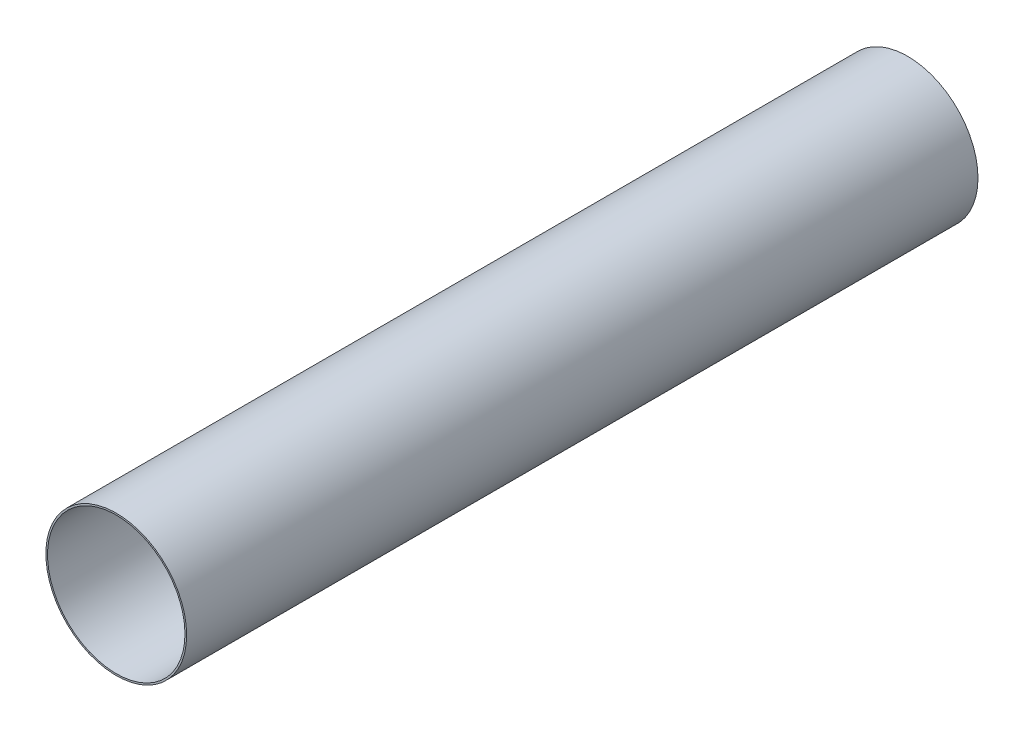
ISO-10303-21;
HEADER;
FILE_DESCRIPTION(('STEP AP214'),'2;1');
FILE_NAME('part.step','',(''),(''),'','','');
FILE_SCHEMA(('AUTOMOTIVE_DESIGN { 1 0 10303 214 1 1 1 1 }'));
ENDSEC;
DATA;
#1=APPLICATION_CONTEXT('core data for automotive mechanical design processes');
#2=APPLICATION_PROTOCOL_DEFINITION('international standard','automotive_design',2000,#1);
#3=PRODUCT_CONTEXT('',#1,'mechanical');
#4=PRODUCT('Part','Part','',(#3));
#5=PRODUCT_RELATED_PRODUCT_CATEGORY('part','',(#4));
#6=PRODUCT_DEFINITION_FORMATION('','',#4);
#7=PRODUCT_DEFINITION_CONTEXT('part definition',#1,'design');
#8=PRODUCT_DEFINITION('design','',#6,#7);
#9=PRODUCT_DEFINITION_SHAPE('','',#8);
#10=(LENGTH_UNIT() NAMED_UNIT(*) SI_UNIT(.MILLI.,.METRE.));
#11=(NAMED_UNIT(*) PLANE_ANGLE_UNIT() SI_UNIT($,.RADIAN.));
#12=(NAMED_UNIT(*) SI_UNIT($,.STERADIAN.) SOLID_ANGLE_UNIT());
#13=UNCERTAINTY_MEASURE_WITH_UNIT(LENGTH_MEASURE(1.E-05),#10,'distance_accuracy_value','');
#14=(GEOMETRIC_REPRESENTATION_CONTEXT(3) GLOBAL_UNCERTAINTY_ASSIGNED_CONTEXT((#13)) GLOBAL_UNIT_ASSIGNED_CONTEXT((#10,
#11,#12)) REPRESENTATION_CONTEXT('',''));
#15=CARTESIAN_POINT('',(0.,0.,0.));
#16=DIRECTION('',(0.,0.,1.));
#17=DIRECTION('',(1.,0.,0.));
#18=AXIS2_PLACEMENT_3D('',#15,#16,#17);
#19=CARTESIAN_POINT('',(0.,0.,950.));
#20=DIRECTION('',(0.,0.,1.));
#21=DIRECTION('',(1.,0.,0.));
#22=AXIS2_PLACEMENT_3D('',#19,#20,#21);
#23=CYLINDRICAL_SURFACE('',#22,82.5);
#24=CARTESIAN_POINT('',(0.,0.,0.));
#25=DIRECTION('',(0.,0.,1.));
#26=DIRECTION('',(1.,0.,0.));
#27=AXIS2_PLACEMENT_3D('',#24,#25,#26);
#28=CIRCLE('',#27,82.5);
#29=CARTESIAN_POINT('',(82.5,0.,0.));
#30=VERTEX_POINT('',#29);
#31=EDGE_CURVE('E27',#30,#30,#28,.F.);
#32=ORIENTED_EDGE('',*,*,#31,.T.);
#33=EDGE_LOOP('',(#32));
#34=FACE_BOUND('',#33,.T.);
#35=CARTESIAN_POINT('',(0.,0.,950.));
#36=DIRECTION('',(0.,0.,1.));
#37=DIRECTION('',(1.,0.,0.));
#38=AXIS2_PLACEMENT_3D('',#35,#36,#37);
#39=CIRCLE('',#38,82.5);
#40=CARTESIAN_POINT('',(82.5,0.,950.));
#41=VERTEX_POINT('',#40);
#42=EDGE_CURVE('E18',#41,#41,#39,.F.);
#43=ORIENTED_EDGE('',*,*,#42,.F.);
#44=EDGE_LOOP('',(#43));
#45=FACE_BOUND('',#44,.T.);
#46=ADVANCED_FACE('F15',(#34,#45),#23,.F.);
#47=CARTESIAN_POINT('',(0.,0.,950.));
#48=DIRECTION('',(0.,0.,1.));
#49=DIRECTION('',(1.,0.,0.));
#50=AXIS2_PLACEMENT_3D('',#47,#48,#49);
#51=PLANE('',#50);
#52=CARTESIAN_POINT('',(0.,0.,950.));
#53=DIRECTION('',(0.,0.,1.));
#54=DIRECTION('',(1.,0.,0.));
#55=AXIS2_PLACEMENT_3D('',#52,#53,#54);
#56=CIRCLE('',#55,84.5);
#57=CARTESIAN_POINT('',(84.5,0.,950.));
#58=VERTEX_POINT('',#57);
#59=EDGE_CURVE('E22',#58,#58,#56,.F.);
#60=ORIENTED_EDGE('',*,*,#59,.F.);
#61=EDGE_LOOP('',(#60));
#62=FACE_BOUND('',#61,.T.);
#63=ORIENTED_EDGE('',*,*,#42,.T.);
#64=EDGE_LOOP('',(#63));
#65=FACE_BOUND('',#64,.T.);
#66=ADVANCED_FACE('F35',(#62,#65),#51,.T.);
#67=CARTESIAN_POINT('',(0.,0.,0.));
#68=DIRECTION('',(0.,0.,1.));
#69=DIRECTION('',(1.,0.,0.));
#70=AXIS2_PLACEMENT_3D('',#67,#68,#69);
#71=PLANE('',#70);
#72=CARTESIAN_POINT('',(0.,0.,0.));
#73=DIRECTION('',(0.,0.,1.));
#74=DIRECTION('',(1.,0.,0.));
#75=AXIS2_PLACEMENT_3D('',#72,#73,#74);
#76=CIRCLE('',#75,84.5);
#77=CARTESIAN_POINT('',(84.5,0.,0.));
#78=VERTEX_POINT('',#77);
#79=EDGE_CURVE('E10',#78,#78,#76,.T.);
#80=ORIENTED_EDGE('',*,*,#79,.F.);
#81=EDGE_LOOP('',(#80));
#82=FACE_BOUND('',#81,.T.);
#83=ORIENTED_EDGE('',*,*,#31,.F.);
#84=EDGE_LOOP('',(#83));
#85=FACE_BOUND('',#84,.T.);
#86=ADVANCED_FACE('F42',(#82,#85),#71,.F.);
#87=CARTESIAN_POINT('',(0.,0.,950.));
#88=DIRECTION('',(0.,0.,1.));
#89=DIRECTION('',(1.,0.,0.));
#90=AXIS2_PLACEMENT_3D('',#87,#88,#89);
#91=CYLINDRICAL_SURFACE('',#90,84.5);
#92=ORIENTED_EDGE('',*,*,#79,.T.);
#93=EDGE_LOOP('',(#92));
#94=FACE_BOUND('',#93,.T.);
#95=ORIENTED_EDGE('',*,*,#59,.T.);
#96=EDGE_LOOP('',(#95));
#97=FACE_BOUND('',#96,.T.);
#98=ADVANCED_FACE('F44',(#94,#97),#91,.T.);
#99=CLOSED_SHELL('',(#46,#66,#86,#98));
#100=MANIFOLD_SOLID_BREP('B1',#99);
#101=ADVANCED_BREP_SHAPE_REPRESENTATION('',(#18,#100),#14);
#102=SHAPE_DEFINITION_REPRESENTATION(#9,#101);
ENDSEC;
END-ISO-10303-21;
